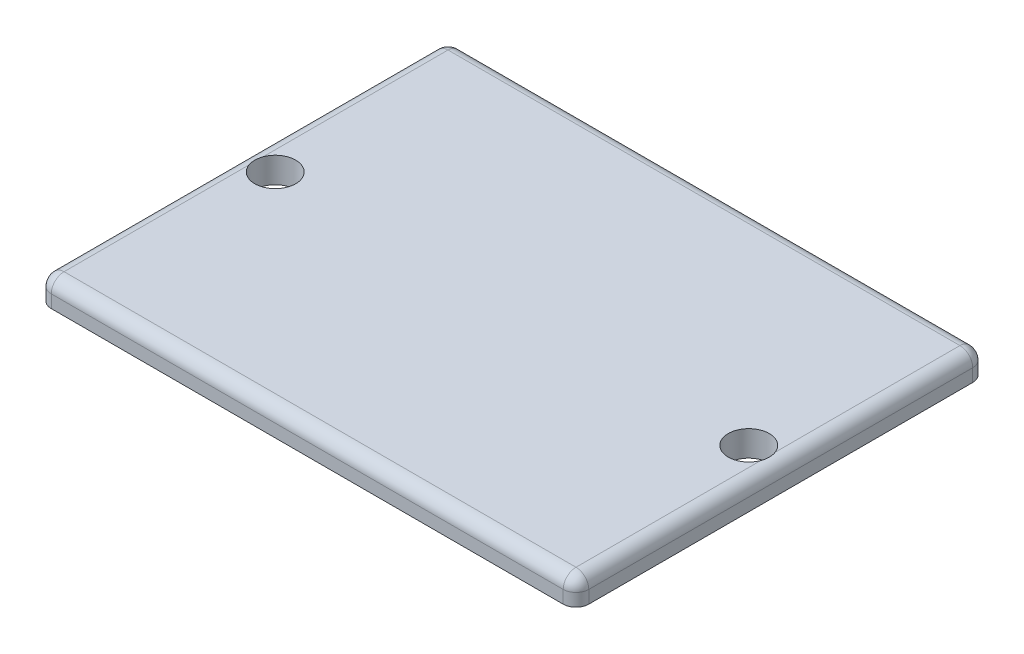
ISO-10303-21;
HEADER;
FILE_DESCRIPTION(('STEP AP214'),'2;1');
FILE_NAME('part.step','',(''),(''),'','','');
FILE_SCHEMA(('AUTOMOTIVE_DESIGN { 1 0 10303 214 1 1 1 1 }'));
ENDSEC;
DATA;
#1=APPLICATION_CONTEXT('core data for automotive mechanical design processes');
#2=APPLICATION_PROTOCOL_DEFINITION('international standard','automotive_design',2000,#1);
#3=PRODUCT_CONTEXT('',#1,'mechanical');
#4=PRODUCT('Part','Part','',(#3));
#5=PRODUCT_RELATED_PRODUCT_CATEGORY('part','',(#4));
#6=PRODUCT_DEFINITION_FORMATION('','',#4);
#7=PRODUCT_DEFINITION_CONTEXT('part definition',#1,'design');
#8=PRODUCT_DEFINITION('design','',#6,#7);
#9=PRODUCT_DEFINITION_SHAPE('','',#8);
#10=(LENGTH_UNIT() NAMED_UNIT(*) SI_UNIT(.MILLI.,.METRE.));
#11=(NAMED_UNIT(*) PLANE_ANGLE_UNIT() SI_UNIT($,.RADIAN.));
#12=(NAMED_UNIT(*) SI_UNIT($,.STERADIAN.) SOLID_ANGLE_UNIT());
#13=UNCERTAINTY_MEASURE_WITH_UNIT(LENGTH_MEASURE(1.E-05),#10,'distance_accuracy_value','');
#14=(GEOMETRIC_REPRESENTATION_CONTEXT(3) GLOBAL_UNCERTAINTY_ASSIGNED_CONTEXT((#13)) GLOBAL_UNIT_ASSIGNED_CONTEXT((#10,
#11,#12)) REPRESENTATION_CONTEXT('',''));
#15=CARTESIAN_POINT('',(0.,0.,0.));
#16=DIRECTION('',(0.,0.,1.));
#17=DIRECTION('',(1.,0.,0.));
#18=AXIS2_PLACEMENT_3D('',#15,#16,#17);
#19=CARTESIAN_POINT('',(0.,2.,0.));
#20=DIRECTION('',(0.,-1.,0.));
#21=DIRECTION('',(0.,0.,-1.));
#22=AXIS2_PLACEMENT_3D('',#19,#20,#21);
#23=PLANE('',#22);
#24=CARTESIAN_POINT('',(-18.5,2.,0.));
#25=DIRECTION('',(0.,1.,0.));
#26=DIRECTION('',(0.,0.,1.));
#27=AXIS2_PLACEMENT_3D('',#24,#25,#26);
#28=CIRCLE('',#27,1.6);
#29=CARTESIAN_POINT('',(-20.,2.,0.556776436282985));
#30=VERTEX_POINT('',#29);
#31=CARTESIAN_POINT('',(-20.,2.,-0.556776436282985));
#32=VERTEX_POINT('',#31);
#33=EDGE_CURVE('E132',#30,#32,#28,.T.);
#34=ORIENTED_EDGE('',*,*,#33,.F.);
#35=DIRECTION('',(0.,0.,1.));
#36=VECTOR('',#35,1.);
#37=CARTESIAN_POINT('',(-20.,2.,0.));
#38=LINE('',#37,#36);
#39=CARTESIAN_POINT('',(-20.,2.,15.));
#40=VERTEX_POINT('',#39);
#41=EDGE_CURVE('E153',#30,#40,#38,.T.);
#42=ORIENTED_EDGE('',*,*,#41,.T.);
#43=DIRECTION('',(1.,0.,0.));
#44=VECTOR('',#43,1.);
#45=CARTESIAN_POINT('',(0.,2.,15.));
#46=LINE('',#45,#44);
#47=CARTESIAN_POINT('',(20.,2.,15.));
#48=VERTEX_POINT('',#47);
#49=EDGE_CURVE('E346',#40,#48,#46,.T.);
#50=ORIENTED_EDGE('',*,*,#49,.T.);
#51=DIRECTION('',(0.,0.,-1.));
#52=VECTOR('',#51,1.);
#53=CARTESIAN_POINT('',(20.,2.,0.));
#54=LINE('',#53,#52);
#55=CARTESIAN_POINT('',(20.,2.,0.556776436283018));
#56=VERTEX_POINT('',#55);
#57=EDGE_CURVE('E141',#48,#56,#54,.T.);
#58=ORIENTED_EDGE('',*,*,#57,.T.);
#59=CARTESIAN_POINT('',(18.5,2.,0.));
#60=DIRECTION('',(0.,1.,0.));
#61=DIRECTION('',(0.,0.,-1.));
#62=AXIS2_PLACEMENT_3D('',#59,#60,#61);
#63=CIRCLE('',#62,1.6);
#64=CARTESIAN_POINT('',(20.,2.,-0.556776436283027));
#65=VERTEX_POINT('',#64);
#66=EDGE_CURVE('E315',#65,#56,#63,.T.);
#67=ORIENTED_EDGE('',*,*,#66,.F.);
#68=DIRECTION('',(0.,0.,-1.));
#69=VECTOR('',#68,1.);
#70=CARTESIAN_POINT('',(20.,2.,0.));
#71=LINE('',#70,#69);
#72=CARTESIAN_POINT('',(20.,2.,-15.));
#73=VERTEX_POINT('',#72);
#74=EDGE_CURVE('E339',#65,#73,#71,.T.);
#75=ORIENTED_EDGE('',*,*,#74,.T.);
#76=DIRECTION('',(-1.,0.,0.));
#77=VECTOR('',#76,1.);
#78=CARTESIAN_POINT('',(0.,2.,-15.));
#79=LINE('',#78,#77);
#80=CARTESIAN_POINT('',(-20.,2.,-15.));
#81=VERTEX_POINT('',#80);
#82=EDGE_CURVE('E135',#73,#81,#79,.T.);
#83=ORIENTED_EDGE('',*,*,#82,.T.);
#84=DIRECTION('',(0.,0.,1.));
#85=VECTOR('',#84,1.);
#86=CARTESIAN_POINT('',(-20.,2.,0.));
#87=LINE('',#86,#85);
#88=EDGE_CURVE('E130',#81,#32,#87,.T.);
#89=ORIENTED_EDGE('',*,*,#88,.T.);
#90=EDGE_LOOP('',(#34,#42,#50,#58,#67,#75,#83,#89));
#91=FACE_BOUND('',#90,.T.);
#92=ADVANCED_FACE('F39',(#91),#23,.F.);
#93=CARTESIAN_POINT('',(0.,0.,0.));
#94=DIRECTION('',(0.,-1.,0.));
#95=DIRECTION('',(0.,0.,-1.));
#96=AXIS2_PLACEMENT_3D('',#93,#94,#95);
#97=PLANE('',#96);
#98=CARTESIAN_POINT('',(-18.5,0.,0.));
#99=DIRECTION('',(0.,1.,0.));
#100=DIRECTION('',(0.,0.,1.));
#101=AXIS2_PLACEMENT_3D('',#98,#99,#100);
#102=CIRCLE('',#101,1.6);
#103=CARTESIAN_POINT('',(-18.5,0.,1.6));
#104=VERTEX_POINT('',#103);
#105=EDGE_CURVE('E149',#104,#104,#102,.T.);
#106=ORIENTED_EDGE('',*,*,#105,.T.);
#107=EDGE_LOOP('',(#106));
#108=FACE_BOUND('',#107,.T.);
#109=DIRECTION('',(-1.,0.,0.));
#110=VECTOR('',#109,1.);
#111=CARTESIAN_POINT('',(-21.,0.,-16.));
#112=LINE('',#111,#110);
#113=CARTESIAN_POINT('',(20.,0.,-16.));
#114=VERTEX_POINT('',#113);
#115=CARTESIAN_POINT('',(-20.,0.,-16.));
#116=VERTEX_POINT('',#115);
#117=EDGE_CURVE('E328',#114,#116,#112,.T.);
#118=ORIENTED_EDGE('',*,*,#117,.F.);
#119=CARTESIAN_POINT('',(20.,0.,-15.));
#120=DIRECTION('',(0.,-1.,0.));
#121=DIRECTION('',(0.,0.,-1.));
#122=AXIS2_PLACEMENT_3D('',#119,#120,#121);
#123=CIRCLE('',#122,1.);
#124=CARTESIAN_POINT('',(21.,0.,-15.));
#125=VERTEX_POINT('',#124);
#126=EDGE_CURVE('E11',#114,#125,#123,.T.);
#127=ORIENTED_EDGE('',*,*,#126,.T.);
#128=DIRECTION('',(0.,0.,-1.));
#129=VECTOR('',#128,1.);
#130=CARTESIAN_POINT('',(21.,0.,16.));
#131=LINE('',#130,#129);
#132=CARTESIAN_POINT('',(21.,0.,15.));
#133=VERTEX_POINT('',#132);
#134=EDGE_CURVE('E148',#133,#125,#131,.T.);
#135=ORIENTED_EDGE('',*,*,#134,.F.);
#136=CARTESIAN_POINT('',(20.,0.,15.));
#137=DIRECTION('',(0.,-1.,0.));
#138=DIRECTION('',(0.,0.,-1.));
#139=AXIS2_PLACEMENT_3D('',#136,#137,#138);
#140=CIRCLE('',#139,1.);
#141=CARTESIAN_POINT('',(20.,0.,16.));
#142=VERTEX_POINT('',#141);
#143=EDGE_CURVE('E249',#133,#142,#140,.T.);
#144=ORIENTED_EDGE('',*,*,#143,.T.);
#145=DIRECTION('',(1.,0.,0.));
#146=VECTOR('',#145,1.);
#147=CARTESIAN_POINT('',(-21.,0.,16.));
#148=LINE('',#147,#146);
#149=CARTESIAN_POINT('',(-20.,0.,16.));
#150=VERTEX_POINT('',#149);
#151=EDGE_CURVE('E336',#150,#142,#148,.T.);
#152=ORIENTED_EDGE('',*,*,#151,.F.);
#153=CARTESIAN_POINT('',(-20.,0.,15.));
#154=DIRECTION('',(0.,-1.,0.));
#155=DIRECTION('',(0.,0.,-1.));
#156=AXIS2_PLACEMENT_3D('',#153,#154,#155);
#157=CIRCLE('',#156,1.);
#158=CARTESIAN_POINT('',(-21.,0.,15.));
#159=VERTEX_POINT('',#158);
#160=EDGE_CURVE('E259',#150,#159,#157,.T.);
#161=ORIENTED_EDGE('',*,*,#160,.T.);
#162=DIRECTION('',(0.,0.,1.));
#163=VECTOR('',#162,1.);
#164=CARTESIAN_POINT('',(-21.,0.,16.));
#165=LINE('',#164,#163);
#166=CARTESIAN_POINT('',(-21.,0.,-15.));
#167=VERTEX_POINT('',#166);
#168=EDGE_CURVE('E332',#167,#159,#165,.T.);
#169=ORIENTED_EDGE('',*,*,#168,.F.);
#170=CARTESIAN_POINT('',(-20.,0.,-15.));
#171=DIRECTION('',(0.,-1.,0.));
#172=DIRECTION('',(0.,0.,-1.));
#173=AXIS2_PLACEMENT_3D('',#170,#171,#172);
#174=CIRCLE('',#173,1.);
#175=EDGE_CURVE('E49',#167,#116,#174,.T.);
#176=ORIENTED_EDGE('',*,*,#175,.T.);
#177=EDGE_LOOP('',(#118,#127,#135,#144,#152,#161,#169,#176));
#178=FACE_BOUND('',#177,.T.);
#179=CARTESIAN_POINT('',(18.5,0.,0.));
#180=DIRECTION('',(0.,1.,0.));
#181=DIRECTION('',(0.,0.,-1.));
#182=AXIS2_PLACEMENT_3D('',#179,#180,#181);
#183=CIRCLE('',#182,1.6);
#184=CARTESIAN_POINT('',(18.5,0.,-1.60000000000001));
#185=VERTEX_POINT('',#184);
#186=EDGE_CURVE('E311',#185,#185,#183,.T.);
#187=ORIENTED_EDGE('',*,*,#186,.T.);
#188=EDGE_LOOP('',(#187));
#189=FACE_BOUND('',#188,.T.);
#190=ADVANCED_FACE('F207',(#108,#178,#189),#97,.T.);
#191=CARTESIAN_POINT('',(21.,2.,16.));
#192=DIRECTION('',(-1.,0.,0.));
#193=DIRECTION('',(0.,0.,1.));
#194=AXIS2_PLACEMENT_3D('',#191,#192,#193);
#195=PLANE('',#194);
#196=ORIENTED_EDGE('',*,*,#134,.T.);
#197=DIRECTION('',(0.,-1.,0.));
#198=VECTOR('',#197,1.);
#199=CARTESIAN_POINT('',(21.,2.,-15.));
#200=LINE('',#199,#198);
#201=CARTESIAN_POINT('',(21.,1.,-15.));
#202=VERTEX_POINT('',#201);
#203=EDGE_CURVE('E57',#125,#202,#200,.F.);
#204=ORIENTED_EDGE('',*,*,#203,.T.);
#205=DIRECTION('',(0.,0.,-1.));
#206=VECTOR('',#205,1.);
#207=CARTESIAN_POINT('',(21.,1.,16.));
#208=LINE('',#207,#206);
#209=CARTESIAN_POINT('',(21.,1.,15.));
#210=VERTEX_POINT('',#209);
#211=EDGE_CURVE('E62',#202,#210,#208,.F.);
#212=ORIENTED_EDGE('',*,*,#211,.T.);
#213=DIRECTION('',(0.,-1.,0.));
#214=VECTOR('',#213,1.);
#215=CARTESIAN_POINT('',(21.,2.,15.));
#216=LINE('',#215,#214);
#217=EDGE_CURVE('E251',#210,#133,#216,.T.);
#218=ORIENTED_EDGE('',*,*,#217,.T.);
#219=EDGE_LOOP('',(#196,#204,#212,#218));
#220=FACE_BOUND('',#219,.T.);
#221=ADVANCED_FACE('F211',(#220),#195,.F.);
#222=CARTESIAN_POINT('',(-21.,2.,-16.));
#223=DIRECTION('',(0.,0.,1.));
#224=DIRECTION('',(1.,0.,0.));
#225=AXIS2_PLACEMENT_3D('',#222,#223,#224);
#226=PLANE('',#225);
#227=DIRECTION('',(-1.,0.,0.));
#228=VECTOR('',#227,1.);
#229=CARTESIAN_POINT('',(-21.,1.,-16.));
#230=LINE('',#229,#228);
#231=CARTESIAN_POINT('',(-20.,1.,-16.));
#232=VERTEX_POINT('',#231);
#233=CARTESIAN_POINT('',(20.,1.,-16.));
#234=VERTEX_POINT('',#233);
#235=EDGE_CURVE('E379',#232,#234,#230,.F.);
#236=ORIENTED_EDGE('',*,*,#235,.T.);
#237=DIRECTION('',(0.,-1.,0.));
#238=VECTOR('',#237,1.);
#239=CARTESIAN_POINT('',(20.,2.,-16.));
#240=LINE('',#239,#238);
#241=EDGE_CURVE('E384',#234,#114,#240,.T.);
#242=ORIENTED_EDGE('',*,*,#241,.T.);
#243=ORIENTED_EDGE('',*,*,#117,.T.);
#244=DIRECTION('',(0.,-1.,0.));
#245=VECTOR('',#244,1.);
#246=CARTESIAN_POINT('',(-20.,2.,-16.));
#247=LINE('',#246,#245);
#248=EDGE_CURVE('E375',#116,#232,#247,.F.);
#249=ORIENTED_EDGE('',*,*,#248,.T.);
#250=EDGE_LOOP('',(#236,#242,#243,#249));
#251=FACE_BOUND('',#250,.T.);
#252=ADVANCED_FACE('F222',(#251),#226,.F.);
#253=CARTESIAN_POINT('',(-21.,2.,16.));
#254=DIRECTION('',(1.,0.,0.));
#255=DIRECTION('',(0.,0.,-1.));
#256=AXIS2_PLACEMENT_3D('',#253,#254,#255);
#257=PLANE('',#256);
#258=DIRECTION('',(0.,0.,1.));
#259=VECTOR('',#258,1.);
#260=CARTESIAN_POINT('',(-21.,1.,16.));
#261=LINE('',#260,#259);
#262=CARTESIAN_POINT('',(-21.,1.,15.));
#263=VERTEX_POINT('',#262);
#264=CARTESIAN_POINT('',(-21.,1.,-15.));
#265=VERTEX_POINT('',#264);
#266=EDGE_CURVE('E160',#263,#265,#261,.F.);
#267=ORIENTED_EDGE('',*,*,#266,.T.);
#268=DIRECTION('',(0.,-1.,0.));
#269=VECTOR('',#268,1.);
#270=CARTESIAN_POINT('',(-21.,2.,-15.));
#271=LINE('',#270,#269);
#272=EDGE_CURVE('E373',#265,#167,#271,.T.);
#273=ORIENTED_EDGE('',*,*,#272,.T.);
#274=ORIENTED_EDGE('',*,*,#168,.T.);
#275=DIRECTION('',(0.,-1.,0.));
#276=VECTOR('',#275,1.);
#277=CARTESIAN_POINT('',(-21.,2.,15.));
#278=LINE('',#277,#276);
#279=EDGE_CURVE('E155',#159,#263,#278,.F.);
#280=ORIENTED_EDGE('',*,*,#279,.T.);
#281=EDGE_LOOP('',(#267,#273,#274,#280));
#282=FACE_BOUND('',#281,.T.);
#283=ADVANCED_FACE('F218',(#282),#257,.F.);
#284=CARTESIAN_POINT('',(-21.,2.,16.));
#285=DIRECTION('',(0.,0.,-1.));
#286=DIRECTION('',(-1.,0.,0.));
#287=AXIS2_PLACEMENT_3D('',#284,#285,#286);
#288=PLANE('',#287);
#289=DIRECTION('',(1.,0.,0.));
#290=VECTOR('',#289,1.);
#291=CARTESIAN_POINT('',(-21.,1.,16.));
#292=LINE('',#291,#290);
#293=CARTESIAN_POINT('',(20.,1.,16.));
#294=VERTEX_POINT('',#293);
#295=CARTESIAN_POINT('',(-20.,1.,16.));
#296=VERTEX_POINT('',#295);
#297=EDGE_CURVE('E162',#294,#296,#292,.F.);
#298=ORIENTED_EDGE('',*,*,#297,.T.);
#299=DIRECTION('',(0.,-1.,0.));
#300=VECTOR('',#299,1.);
#301=CARTESIAN_POINT('',(-20.,2.,16.));
#302=LINE('',#301,#300);
#303=EDGE_CURVE('E156',#296,#150,#302,.T.);
#304=ORIENTED_EDGE('',*,*,#303,.T.);
#305=ORIENTED_EDGE('',*,*,#151,.T.);
#306=DIRECTION('',(0.,-1.,0.));
#307=VECTOR('',#306,1.);
#308=CARTESIAN_POINT('',(20.,2.,16.));
#309=LINE('',#308,#307);
#310=EDGE_CURVE('E253',#142,#294,#309,.F.);
#311=ORIENTED_EDGE('',*,*,#310,.T.);
#312=EDGE_LOOP('',(#298,#304,#305,#311));
#313=FACE_BOUND('',#312,.T.);
#314=ADVANCED_FACE('F215',(#313),#288,.F.);
#315=CARTESIAN_POINT('',(-18.5,2.,0.));
#316=DIRECTION('',(0.,-1.,0.));
#317=DIRECTION('',(0.,0.,-1.));
#318=AXIS2_PLACEMENT_3D('',#315,#316,#317);
#319=CYLINDRICAL_SURFACE('',#318,1.6);
#320=ORIENTED_EDGE('',*,*,#33,.T.);
#321=CARTESIAN_POINT('',(-20.,2.,-0.556776436282985));
#322=CARTESIAN_POINT('',(-20.0147391055554,1.99998496745091,-0.517078477432223));
#323=CARTESIAN_POINT('',(-20.0278943767572,1.99967353177831,-0.476796243913241));
#324=CARTESIAN_POINT('',(-20.0509713450384,1.99877091354686,-0.395319497997566));
#325=CARTESIAN_POINT('',(-20.060893109917,1.99817973685417,-0.354125004748189));
#326=CARTESIAN_POINT('',(-20.0774516887611,1.99702970332047,-0.271008526878178));
#327=CARTESIAN_POINT('',(-20.0840829530123,1.99647090247629,-0.229085435807962));
#328=CARTESIAN_POINT('',(-20.0939945861068,1.99558541974185,-0.144843909600368));
#329=CARTESIAN_POINT('',(-20.0972750411779,1.99525873187858,-0.102525484664577));
#330=CARTESIAN_POINT('',(-20.1005598224054,1.99493256521579,-0.0151976513167181));
#331=CARTESIAN_POINT('',(-20.1003542558848,1.99495404633261,0.0298198772089625));
#332=CARTESIAN_POINT('',(-20.0961506996098,1.99536899343583,0.11969958650906));
#333=CARTESIAN_POINT('',(-20.0921506855074,1.99576265798271,0.164561671530849));
#334=CARTESIAN_POINT('',(-20.0804019184843,1.9967798384245,0.253660743085494));
#335=CARTESIAN_POINT('',(-20.0726635739649,1.99740271499809,0.297899116289938));
#336=CARTESIAN_POINT('',(-20.0534963082465,1.99861424001894,0.385565872890411));
#337=CARTESIAN_POINT('',(-20.0420683406369,1.99920289726391,0.428994462512064));
#338=CARTESIAN_POINT('',(-20.0244296937916,1.99971111322623,0.486146203287074));
#339=CARTESIAN_POINT('',(-20.0198186839963,1.99981512644983,0.500374860267179));
#340=CARTESIAN_POINT('',(-20.0102037884615,1.99995952394309,0.528684815779245));
#341=CARTESIAN_POINT('',(-20.0052002606417,1.99999996548887,0.542766235589528));
#342=CARTESIAN_POINT('',(-20.,2.,0.556776436282985));
#343=B_SPLINE_CURVE_WITH_KNOTS('',3,(#321,#322,#323,#324,#325,#326,#327,#328,#329,#330,#331,
#332,#333,#334,#335,#336,#337,#338,#339,#340,#341,#342),.UNSPECIFIED.,.F.,.F.,(4,2,2,2,2,2,2,2,
2,2,4),(0.,0.126998583234677,0.253994503431988,0.381203891347207,0.508410005643235,
0.643300992568258,0.778263984695445,0.912853354704602,1.04740796766765,1.09227609232235,
1.1371037689736),.UNSPECIFIED.);
#344=EDGE_CURVE('E146',#32,#30,#343,.T.);
#345=ORIENTED_EDGE('',*,*,#344,.T.);
#346=EDGE_LOOP('',(#320,#345));
#347=FACE_BOUND('',#346,.T.);
#348=ORIENTED_EDGE('',*,*,#105,.F.);
#349=EDGE_LOOP('',(#348));
#350=FACE_BOUND('',#349,.T.);
#351=ADVANCED_FACE('F144',(#347,#350),#319,.F.);
#352=CARTESIAN_POINT('',(18.5,2.,0.));
#353=DIRECTION('',(0.,-1.,0.));
#354=DIRECTION('',(0.,0.,-1.));
#355=AXIS2_PLACEMENT_3D('',#352,#353,#354);
#356=CYLINDRICAL_SURFACE('',#355,1.6);
#357=ORIENTED_EDGE('',*,*,#66,.T.);
#358=CARTESIAN_POINT('',(20.,2.,0.556776436283018));
#359=CARTESIAN_POINT('',(20.0147391055554,1.99998496745091,0.517078477432256));
#360=CARTESIAN_POINT('',(20.0278943767572,1.99967353177831,0.476796243913274));
#361=CARTESIAN_POINT('',(20.0509713450384,1.99877091354686,0.395319497997599));
#362=CARTESIAN_POINT('',(20.060893109917,1.99817973685417,0.354125004748222));
#363=CARTESIAN_POINT('',(20.0774516887611,1.99702970332047,0.27100852687821));
#364=CARTESIAN_POINT('',(20.0840829530123,1.99647090247629,0.229085435807995));
#365=CARTESIAN_POINT('',(20.0939945861068,1.99558541974185,0.144843909600401));
#366=CARTESIAN_POINT('',(20.0972750411779,1.99525873187858,0.102525484664611));
#367=CARTESIAN_POINT('',(20.1005598224054,1.99493256521579,0.0151976513167517));
#368=CARTESIAN_POINT('',(20.1003542558848,1.99495404633261,-0.0298198772089288));
#369=CARTESIAN_POINT('',(20.0961506996098,1.99536899343583,-0.119699586509026));
#370=CARTESIAN_POINT('',(20.0921506855074,1.99576265798271,-0.164561671530815));
#371=CARTESIAN_POINT('',(20.0804019184843,1.9967798384245,-0.25366074308546));
#372=CARTESIAN_POINT('',(20.0726635739649,1.99740271499809,-0.297899116289903));
#373=CARTESIAN_POINT('',(20.0534963082465,1.99861424001894,-0.385565872890376));
#374=CARTESIAN_POINT('',(20.0420683406369,1.99920289726391,-0.42899446251203));
#375=CARTESIAN_POINT('',(20.0244296937916,1.99971111322623,-0.486146203287053));
#376=CARTESIAN_POINT('',(20.0198186839963,1.99981512644983,-0.500374860267171));
#377=CARTESIAN_POINT('',(20.0102037884615,1.99995952394309,-0.528684815779262));
#378=CARTESIAN_POINT('',(20.0052002606416,1.99999996548887,-0.542766235589558));
#379=CARTESIAN_POINT('',(20.,2.,-0.556776436283027));
#380=B_SPLINE_CURVE_WITH_KNOTS('',3,(#358,#359,#360,#361,#362,#363,#364,#365,#366,#367,#368,
#369,#370,#371,#372,#373,#374,#375,#376,#377,#378,#379),.UNSPECIFIED.,.F.,.F.,(4,2,2,2,2,2,2,2,
2,2,4),(0.,0.126998583234678,0.25399450343199,0.381203891347208,0.508410005643237,
0.643300992568259,0.778263984695445,0.912853354704602,1.04740796766765,1.09227609232239,
1.13710376897368),.UNSPECIFIED.);
#381=EDGE_CURVE('E363',#56,#65,#380,.T.);
#382=ORIENTED_EDGE('',*,*,#381,.T.);
#383=EDGE_LOOP('',(#357,#382));
#384=FACE_BOUND('',#383,.T.);
#385=ORIENTED_EDGE('',*,*,#186,.F.);
#386=EDGE_LOOP('',(#385));
#387=FACE_BOUND('',#386,.T.);
#388=ADVANCED_FACE('F203',(#384,#387),#356,.F.);
#389=CARTESIAN_POINT('',(-20.,2.,-15.));
#390=DIRECTION('',(0.,-1.,0.));
#391=DIRECTION('',(0.,0.,-1.));
#392=AXIS2_PLACEMENT_3D('',#389,#390,#391);
#393=CYLINDRICAL_SURFACE('',#392,1.);
#394=ORIENTED_EDGE('',*,*,#175,.F.);
#395=ORIENTED_EDGE('',*,*,#272,.F.);
#396=CARTESIAN_POINT('',(-20.,1.,-15.));
#397=DIRECTION('',(0.,1.,0.));
#398=DIRECTION('',(0.,0.,1.));
#399=AXIS2_PLACEMENT_3D('',#396,#397,#398);
#400=CIRCLE('',#399,1.);
#401=EDGE_CURVE('E43',#232,#265,#400,.T.);
#402=ORIENTED_EDGE('',*,*,#401,.F.);
#403=ORIENTED_EDGE('',*,*,#248,.F.);
#404=EDGE_LOOP('',(#394,#395,#402,#403));
#405=FACE_BOUND('',#404,.T.);
#406=ADVANCED_FACE('F41',(#405),#393,.T.);
#407=CARTESIAN_POINT('',(0.,1.,-15.));
#408=DIRECTION('',(-1.,0.,0.));
#409=DIRECTION('',(0.,0.,1.));
#410=AXIS2_PLACEMENT_3D('',#407,#408,#409);
#411=CYLINDRICAL_SURFACE('',#410,1.);
#412=CARTESIAN_POINT('',(20.,1.,-15.));
#413=DIRECTION('',(1.,0.,0.));
#414=DIRECTION('',(0.,0.,-1.));
#415=AXIS2_PLACEMENT_3D('',#412,#413,#414);
#416=CIRCLE('',#415,1.);
#417=EDGE_CURVE('E302',#234,#73,#416,.T.);
#418=ORIENTED_EDGE('',*,*,#417,.F.);
#419=ORIENTED_EDGE('',*,*,#235,.F.);
#420=CARTESIAN_POINT('',(-20.,1.,-15.));
#421=DIRECTION('',(-1.,0.,0.));
#422=DIRECTION('',(0.,0.,1.));
#423=AXIS2_PLACEMENT_3D('',#420,#421,#422);
#424=CIRCLE('',#423,1.);
#425=EDGE_CURVE('E305',#81,#232,#424,.T.);
#426=ORIENTED_EDGE('',*,*,#425,.F.);
#427=ORIENTED_EDGE('',*,*,#82,.F.);
#428=EDGE_LOOP('',(#418,#419,#426,#427));
#429=FACE_BOUND('',#428,.T.);
#430=ADVANCED_FACE('F196',(#429),#411,.T.);
#431=CARTESIAN_POINT('',(20.,2.,-15.));
#432=DIRECTION('',(0.,-1.,0.));
#433=DIRECTION('',(0.,0.,-1.));
#434=AXIS2_PLACEMENT_3D('',#431,#432,#433);
#435=CYLINDRICAL_SURFACE('',#434,1.);
#436=ORIENTED_EDGE('',*,*,#126,.F.);
#437=ORIENTED_EDGE('',*,*,#241,.F.);
#438=CARTESIAN_POINT('',(20.,1.,-15.));
#439=DIRECTION('',(0.,1.,0.));
#440=DIRECTION('',(0.,0.,1.));
#441=AXIS2_PLACEMENT_3D('',#438,#439,#440);
#442=CIRCLE('',#441,1.);
#443=EDGE_CURVE('E298',#202,#234,#442,.T.);
#444=ORIENTED_EDGE('',*,*,#443,.F.);
#445=ORIENTED_EDGE('',*,*,#203,.F.);
#446=EDGE_LOOP('',(#436,#437,#444,#445));
#447=FACE_BOUND('',#446,.T.);
#448=ADVANCED_FACE('F193',(#447),#435,.T.);
#449=CARTESIAN_POINT('',(-20.,1.,-15.));
#450=DIRECTION('',(0.,0.,-1.));
#451=DIRECTION('',(-1.,0.,0.));
#452=AXIS2_PLACEMENT_3D('',#449,#450,#451);
#453=SPHERICAL_SURFACE('',#452,1.);
#454=ORIENTED_EDGE('',*,*,#425,.T.);
#455=ORIENTED_EDGE('',*,*,#401,.T.);
#456=CARTESIAN_POINT('',(-20.,1.,-15.));
#457=DIRECTION('',(0.,0.,-1.));
#458=DIRECTION('',(-1.,0.,0.));
#459=AXIS2_PLACEMENT_3D('',#456,#457,#458);
#460=CIRCLE('',#459,1.);
#461=EDGE_CURVE('E295',#81,#265,#460,.F.);
#462=ORIENTED_EDGE('',*,*,#461,.F.);
#463=EDGE_LOOP('',(#454,#455,#462));
#464=FACE_BOUND('',#463,.T.);
#465=ADVANCED_FACE('F189',(#464),#453,.T.);
#466=CARTESIAN_POINT('',(20.,1.,-15.));
#467=DIRECTION('',(0.,0.,-1.));
#468=DIRECTION('',(-1.,0.,0.));
#469=AXIS2_PLACEMENT_3D('',#466,#467,#468);
#470=SPHERICAL_SURFACE('',#469,1.);
#471=ORIENTED_EDGE('',*,*,#443,.T.);
#472=ORIENTED_EDGE('',*,*,#417,.T.);
#473=CARTESIAN_POINT('',(20.,1.,-15.));
#474=DIRECTION('',(0.,0.,-1.));
#475=DIRECTION('',(-1.,0.,0.));
#476=AXIS2_PLACEMENT_3D('',#473,#474,#475);
#477=CIRCLE('',#476,1.);
#478=EDGE_CURVE('E291',#202,#73,#477,.F.);
#479=ORIENTED_EDGE('',*,*,#478,.F.);
#480=EDGE_LOOP('',(#471,#472,#479));
#481=FACE_BOUND('',#480,.T.);
#482=ADVANCED_FACE('F185',(#481),#470,.T.);
#483=CARTESIAN_POINT('',(-20.,2.,15.));
#484=DIRECTION('',(0.,-1.,0.));
#485=DIRECTION('',(0.,0.,-1.));
#486=AXIS2_PLACEMENT_3D('',#483,#484,#485);
#487=CYLINDRICAL_SURFACE('',#486,1.);
#488=ORIENTED_EDGE('',*,*,#160,.F.);
#489=ORIENTED_EDGE('',*,*,#303,.F.);
#490=CARTESIAN_POINT('',(-20.,1.,15.));
#491=DIRECTION('',(0.,1.,0.));
#492=DIRECTION('',(0.,0.,1.));
#493=AXIS2_PLACEMENT_3D('',#490,#491,#492);
#494=CIRCLE('',#493,1.);
#495=EDGE_CURVE('E287',#263,#296,#494,.T.);
#496=ORIENTED_EDGE('',*,*,#495,.F.);
#497=ORIENTED_EDGE('',*,*,#279,.F.);
#498=EDGE_LOOP('',(#488,#489,#496,#497));
#499=FACE_BOUND('',#498,.T.);
#500=ADVANCED_FACE('F180',(#499),#487,.T.);
#501=CARTESIAN_POINT('',(-20.,1.,0.));
#502=DIRECTION('',(0.,0.,1.));
#503=DIRECTION('',(1.,0.,0.));
#504=AXIS2_PLACEMENT_3D('',#501,#502,#503);
#505=CYLINDRICAL_SURFACE('',#504,1.);
#506=ORIENTED_EDGE('',*,*,#461,.T.);
#507=ORIENTED_EDGE('',*,*,#266,.F.);
#508=CARTESIAN_POINT('',(-20.,1.,15.));
#509=DIRECTION('',(0.,0.,1.));
#510=DIRECTION('',(1.,0.,0.));
#511=AXIS2_PLACEMENT_3D('',#508,#509,#510);
#512=CIRCLE('',#511,1.);
#513=EDGE_CURVE('E283',#40,#263,#512,.T.);
#514=ORIENTED_EDGE('',*,*,#513,.F.);
#515=ORIENTED_EDGE('',*,*,#41,.F.);
#516=ORIENTED_EDGE('',*,*,#344,.F.);
#517=ORIENTED_EDGE('',*,*,#88,.F.);
#518=EDGE_LOOP('',(#506,#507,#514,#515,#516,#517));
#519=FACE_BOUND('',#518,.T.);
#520=ADVANCED_FACE('F151',(#519),#505,.T.);
#521=CARTESIAN_POINT('',(20.,1.,0.));
#522=DIRECTION('',(0.,0.,-1.));
#523=DIRECTION('',(-1.,0.,0.));
#524=AXIS2_PLACEMENT_3D('',#521,#522,#523);
#525=CYLINDRICAL_SURFACE('',#524,1.);
#526=ORIENTED_EDGE('',*,*,#381,.F.);
#527=ORIENTED_EDGE('',*,*,#57,.F.);
#528=CARTESIAN_POINT('',(20.,1.,15.));
#529=DIRECTION('',(0.,0.,1.));
#530=DIRECTION('',(1.,0.,0.));
#531=AXIS2_PLACEMENT_3D('',#528,#529,#530);
#532=CIRCLE('',#531,1.);
#533=EDGE_CURVE('E279',#210,#48,#532,.T.);
#534=ORIENTED_EDGE('',*,*,#533,.F.);
#535=ORIENTED_EDGE('',*,*,#211,.F.);
#536=ORIENTED_EDGE('',*,*,#478,.T.);
#537=ORIENTED_EDGE('',*,*,#74,.F.);
#538=EDGE_LOOP('',(#526,#527,#534,#535,#536,#537));
#539=FACE_BOUND('',#538,.T.);
#540=ADVANCED_FACE('F179',(#539),#525,.T.);
#541=CARTESIAN_POINT('',(20.,2.,15.));
#542=DIRECTION('',(0.,-1.,0.));
#543=DIRECTION('',(0.,0.,-1.));
#544=AXIS2_PLACEMENT_3D('',#541,#542,#543);
#545=CYLINDRICAL_SURFACE('',#544,1.);
#546=ORIENTED_EDGE('',*,*,#143,.F.);
#547=ORIENTED_EDGE('',*,*,#217,.F.);
#548=CARTESIAN_POINT('',(20.,1.,15.));
#549=DIRECTION('',(0.,1.,0.));
#550=DIRECTION('',(0.,0.,1.));
#551=AXIS2_PLACEMENT_3D('',#548,#549,#550);
#552=CIRCLE('',#551,1.);
#553=EDGE_CURVE('E275',#294,#210,#552,.T.);
#554=ORIENTED_EDGE('',*,*,#553,.F.);
#555=ORIENTED_EDGE('',*,*,#310,.F.);
#556=EDGE_LOOP('',(#546,#547,#554,#555));
#557=FACE_BOUND('',#556,.T.);
#558=ADVANCED_FACE('F239',(#557),#545,.T.);
#559=CARTESIAN_POINT('',(-20.,1.,15.));
#560=DIRECTION('',(-1.,0.,0.));
#561=DIRECTION('',(0.,0.,1.));
#562=AXIS2_PLACEMENT_3D('',#559,#560,#561);
#563=SPHERICAL_SURFACE('',#562,1.);
#564=ORIENTED_EDGE('',*,*,#513,.T.);
#565=ORIENTED_EDGE('',*,*,#495,.T.);
#566=CARTESIAN_POINT('',(-20.,1.,15.));
#567=DIRECTION('',(-1.,0.,0.));
#568=DIRECTION('',(0.,0.,1.));
#569=AXIS2_PLACEMENT_3D('',#566,#567,#568);
#570=CIRCLE('',#569,1.);
#571=EDGE_CURVE('E272',#40,#296,#570,.F.);
#572=ORIENTED_EDGE('',*,*,#571,.F.);
#573=EDGE_LOOP('',(#564,#565,#572));
#574=FACE_BOUND('',#573,.T.);
#575=ADVANCED_FACE('F236',(#574),#563,.T.);
#576=CARTESIAN_POINT('',(20.,1.,15.));
#577=DIRECTION('',(1.,0.,0.));
#578=DIRECTION('',(0.,0.,-1.));
#579=AXIS2_PLACEMENT_3D('',#576,#577,#578);
#580=SPHERICAL_SURFACE('',#579,1.);
#581=ORIENTED_EDGE('',*,*,#553,.T.);
#582=ORIENTED_EDGE('',*,*,#533,.T.);
#583=CARTESIAN_POINT('',(20.,1.,15.));
#584=DIRECTION('',(1.,0.,0.));
#585=DIRECTION('',(0.,0.,-1.));
#586=AXIS2_PLACEMENT_3D('',#583,#584,#585);
#587=CIRCLE('',#586,1.);
#588=EDGE_CURVE('E269',#294,#48,#587,.F.);
#589=ORIENTED_EDGE('',*,*,#588,.F.);
#590=EDGE_LOOP('',(#581,#582,#589));
#591=FACE_BOUND('',#590,.T.);
#592=ADVANCED_FACE('F232',(#591),#580,.T.);
#593=CARTESIAN_POINT('',(0.,1.,15.));
#594=DIRECTION('',(1.,0.,0.));
#595=DIRECTION('',(0.,0.,-1.));
#596=AXIS2_PLACEMENT_3D('',#593,#594,#595);
#597=CYLINDRICAL_SURFACE('',#596,1.);
#598=ORIENTED_EDGE('',*,*,#571,.T.);
#599=ORIENTED_EDGE('',*,*,#297,.F.);
#600=ORIENTED_EDGE('',*,*,#588,.T.);
#601=ORIENTED_EDGE('',*,*,#49,.F.);
#602=EDGE_LOOP('',(#598,#599,#600,#601));
#603=FACE_BOUND('',#602,.T.);
#604=ADVANCED_FACE('F229',(#603),#597,.T.);
#605=CLOSED_SHELL('',(#92,#190,#221,#252,#283,#314,#351,#388,#406,#430,#448,#465,#482,#500,#520,
#540,#558,#575,#592,#604));
#606=MANIFOLD_SOLID_BREP('B2',#605);
#607=ADVANCED_BREP_SHAPE_REPRESENTATION('',(#18,#606),#14);
#608=SHAPE_DEFINITION_REPRESENTATION(#9,#607);
ENDSEC;
END-ISO-10303-21;
